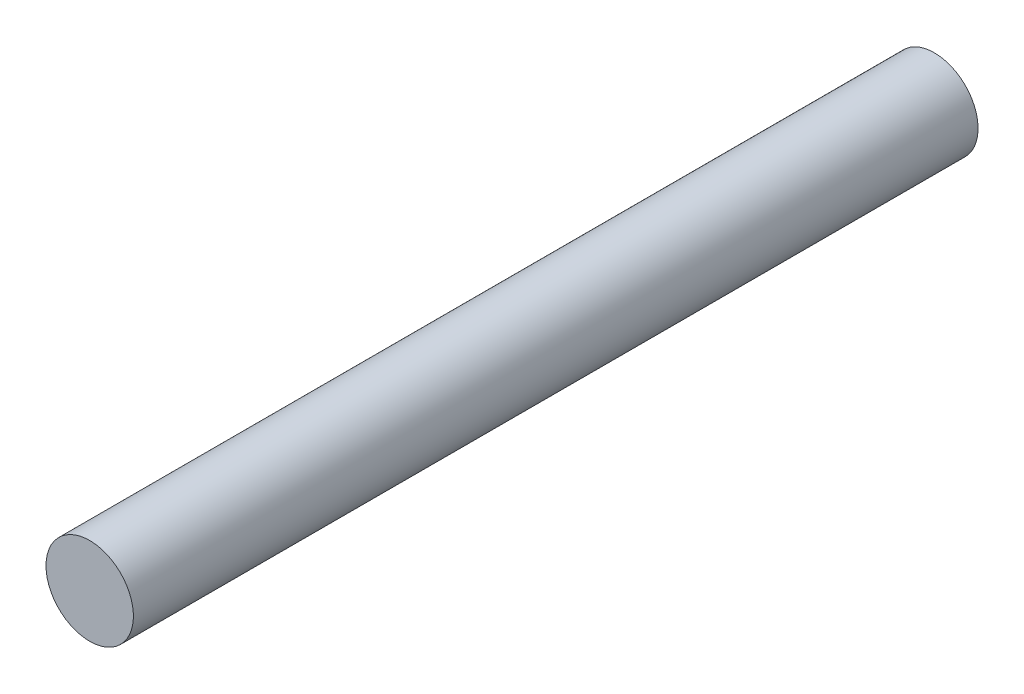
ISO-10303-21;
HEADER;
FILE_DESCRIPTION(('STEP AP214'),'2;1');
FILE_NAME('part.step','',(''),(''),'','','');
FILE_SCHEMA(('AUTOMOTIVE_DESIGN { 1 0 10303 214 1 1 1 1 }'));
ENDSEC;
DATA;
#1=APPLICATION_CONTEXT('core data for automotive mechanical design processes');
#2=APPLICATION_PROTOCOL_DEFINITION('international standard','automotive_design',2000,#1);
#3=PRODUCT_CONTEXT('',#1,'mechanical');
#4=PRODUCT('Part','Part','',(#3));
#5=PRODUCT_RELATED_PRODUCT_CATEGORY('part','',(#4));
#6=PRODUCT_DEFINITION_FORMATION('','',#4);
#7=PRODUCT_DEFINITION_CONTEXT('part definition',#1,'design');
#8=PRODUCT_DEFINITION('design','',#6,#7);
#9=PRODUCT_DEFINITION_SHAPE('','',#8);
#10=(LENGTH_UNIT() NAMED_UNIT(*) SI_UNIT(.MILLI.,.METRE.));
#11=(NAMED_UNIT(*) PLANE_ANGLE_UNIT() SI_UNIT($,.RADIAN.));
#12=(NAMED_UNIT(*) SI_UNIT($,.STERADIAN.) SOLID_ANGLE_UNIT());
#13=UNCERTAINTY_MEASURE_WITH_UNIT(LENGTH_MEASURE(1.E-05),#10,'distance_accuracy_value','');
#14=(GEOMETRIC_REPRESENTATION_CONTEXT(3) GLOBAL_UNCERTAINTY_ASSIGNED_CONTEXT((#13)) GLOBAL_UNIT_ASSIGNED_CONTEXT((#10,
#11,#12)) REPRESENTATION_CONTEXT('',''));
#15=CARTESIAN_POINT('',(0.,0.,0.));
#16=DIRECTION('',(0.,0.,1.));
#17=DIRECTION('',(1.,0.,0.));
#18=AXIS2_PLACEMENT_3D('',#15,#16,#17);
#19=CARTESIAN_POINT('',(0.,0.,58.));
#20=DIRECTION('',(0.,0.,-1.));
#21=DIRECTION('',(-1.,0.,0.));
#22=AXIS2_PLACEMENT_3D('',#19,#20,#21);
#23=CYLINDRICAL_SURFACE('',#22,3.);
#24=CARTESIAN_POINT('',(0.,0.,58.));
#25=DIRECTION('',(0.,0.,1.));
#26=DIRECTION('',(1.,0.,0.));
#27=AXIS2_PLACEMENT_3D('',#24,#25,#26);
#28=CIRCLE('',#27,3.);
#29=CARTESIAN_POINT('',(-3.,0.,58.));
#30=VERTEX_POINT('',#29);
#31=EDGE_CURVE('E10',#30,#30,#28,.T.);
#32=CARTESIAN_POINT('',(0.,0.,0.));
#33=DIRECTION('',(0.,0.,1.));
#34=DIRECTION('',(1.,0.,0.));
#35=AXIS2_PLACEMENT_3D('',#32,#33,#34);
#36=CIRCLE('',#35,3.);
#37=CARTESIAN_POINT('',(-3.,0.,0.));
#38=VERTEX_POINT('',#37);
#39=EDGE_CURVE('E42',#38,#38,#36,.T.);
#40=CARTESIAN_POINT('',(-3.,0.,58.));
#41=CARTESIAN_POINT('',(-3.,0.,57.3958333333333));
#42=CARTESIAN_POINT('',(-3.,0.,56.7916666666667));
#43=CARTESIAN_POINT('',(-3.,0.,55.5833333333333));
#44=CARTESIAN_POINT('',(-3.,0.,54.9791666666667));
#45=CARTESIAN_POINT('',(-3.,0.,53.7708333333333));
#46=CARTESIAN_POINT('',(-3.,0.,53.1666666666667));
#47=CARTESIAN_POINT('',(-3.,0.,51.9583333333333));
#48=CARTESIAN_POINT('',(-3.,0.,51.3541666666667));
#49=CARTESIAN_POINT('',(-3.,0.,50.1458333333333));
#50=CARTESIAN_POINT('',(-3.,0.,49.5416666666667));
#51=CARTESIAN_POINT('',(-3.,0.,48.3333333333333));
#52=CARTESIAN_POINT('',(-3.,0.,47.7291666666667));
#53=CARTESIAN_POINT('',(-3.,0.,46.5208333333333));
#54=CARTESIAN_POINT('',(-3.,0.,45.9166666666667));
#55=CARTESIAN_POINT('',(-3.,0.,44.7083333333333));
#56=CARTESIAN_POINT('',(-3.,0.,44.1041666666667));
#57=CARTESIAN_POINT('',(-3.,0.,42.8958333333333));
#58=CARTESIAN_POINT('',(-3.,0.,42.2916666666667));
#59=CARTESIAN_POINT('',(-3.,0.,41.0833333333333));
#60=CARTESIAN_POINT('',(-3.,0.,40.4791666666667));
#61=CARTESIAN_POINT('',(-3.,0.,39.2708333333333));
#62=CARTESIAN_POINT('',(-3.,0.,38.6666666666667));
#63=CARTESIAN_POINT('',(-3.,0.,37.4583333333333));
#64=CARTESIAN_POINT('',(-3.,0.,36.8541666666667));
#65=CARTESIAN_POINT('',(-3.,0.,35.6458333333333));
#66=CARTESIAN_POINT('',(-3.,0.,35.0416666666667));
#67=CARTESIAN_POINT('',(-3.,0.,33.8333333333333));
#68=CARTESIAN_POINT('',(-3.,0.,33.2291666666667));
#69=CARTESIAN_POINT('',(-3.,0.,32.0208333333333));
#70=CARTESIAN_POINT('',(-3.,0.,31.4166666666667));
#71=CARTESIAN_POINT('',(-3.,0.,30.2083333333333));
#72=CARTESIAN_POINT('',(-3.,0.,29.6041666666667));
#73=CARTESIAN_POINT('',(-3.,0.,28.3958333333333));
#74=CARTESIAN_POINT('',(-3.,0.,27.7916666666667));
#75=CARTESIAN_POINT('',(-3.,0.,26.5833333333333));
#76=CARTESIAN_POINT('',(-3.,0.,25.9791666666667));
#77=CARTESIAN_POINT('',(-3.,0.,24.7708333333333));
#78=CARTESIAN_POINT('',(-3.,0.,24.1666666666667));
#79=CARTESIAN_POINT('',(-3.,0.,22.9583333333333));
#80=CARTESIAN_POINT('',(-3.,0.,22.3541666666667));
#81=CARTESIAN_POINT('',(-3.,0.,21.1458333333333));
#82=CARTESIAN_POINT('',(-3.,0.,20.5416666666667));
#83=CARTESIAN_POINT('',(-3.,0.,19.3333333333333));
#84=CARTESIAN_POINT('',(-3.,0.,18.7291666666667));
#85=CARTESIAN_POINT('',(-3.,0.,17.5208333333333));
#86=CARTESIAN_POINT('',(-3.,0.,16.9166666666667));
#87=CARTESIAN_POINT('',(-3.,0.,15.7083333333333));
#88=CARTESIAN_POINT('',(-3.,0.,15.1041666666667));
#89=CARTESIAN_POINT('',(-3.,0.,13.8958333333333));
#90=CARTESIAN_POINT('',(-3.,0.,13.2916666666667));
#91=CARTESIAN_POINT('',(-3.,0.,12.0833333333333));
#92=CARTESIAN_POINT('',(-3.,0.,11.4791666666667));
#93=CARTESIAN_POINT('',(-3.,0.,10.2708333333333));
#94=CARTESIAN_POINT('',(-3.,0.,9.66666666666667));
#95=CARTESIAN_POINT('',(-3.,0.,8.45833333333333));
#96=CARTESIAN_POINT('',(-3.,0.,7.85416666666667));
#97=CARTESIAN_POINT('',(-3.,0.,6.64583333333333));
#98=CARTESIAN_POINT('',(-3.,0.,6.04166666666667));
#99=CARTESIAN_POINT('',(-3.,0.,4.83333333333333));
#100=CARTESIAN_POINT('',(-3.,0.,4.22916666666667));
#101=CARTESIAN_POINT('',(-3.,0.,3.02083333333334));
#102=CARTESIAN_POINT('',(-3.,0.,2.41666666666667));
#103=CARTESIAN_POINT('',(-3.,0.,1.20833333333333));
#104=CARTESIAN_POINT('',(-3.,0.,0.604166666666666));
#105=CARTESIAN_POINT('',(-3.,0.,0.));
#106=B_SPLINE_CURVE_WITH_KNOTS('',3,(#40,#41,#42,#43,#44,#45,#46,#47,#48,#49,#50,#51,#52,#53,
#54,#55,#56,#57,#58,#59,#60,#61,#62,#63,#64,#65,#66,#67,#68,#69,#70,#71,#72,#73,#74,#75,#76,#77,
#78,#79,#80,#81,#82,#83,#84,#85,#86,#87,#88,#89,#90,#91,#92,#93,#94,#95,#96,#97,#98,#99,#100,
#101,#102,#103,#104,#105),.UNSPECIFIED.,.F.,.F.,(4,2,2,2,2,2,2,2,2,2,2,2,2,2,2,2,2,2,2,2,2,2,2,
2,2,2,2,2,2,2,2,2,4),(0.,1.8125,3.625,5.4375,7.25000000000001,9.0625,10.875,12.6875,14.5,
16.3125,18.125,19.9375,21.75,23.5625,25.375,27.1875,29.,30.8125,32.625,34.4375,36.25,38.0625,
39.875,41.6875,43.5,45.3125,47.125,48.9375,50.75,52.5625,54.375,56.1875,58.),.UNSPECIFIED.);
#107=EDGE_CURVE('BSEAM39',#30,#38,#106,.T.);
#108=ORIENTED_EDGE('',*,*,#31,.F.);
#109=ORIENTED_EDGE('',*,*,#39,.T.);
#110=ORIENTED_EDGE('',*,*,#107,.T.);
#111=ORIENTED_EDGE('',*,*,#107,.F.);
#112=EDGE_LOOP('',(#108,#110,#109,#111));
#113=FACE_BOUND('',#112,.T.);
#114=ADVANCED_FACE('F39',(#113),#23,.T.);
#115=CARTESIAN_POINT('',(0.,0.,58.));
#116=DIRECTION('',(0.,0.,1.));
#117=DIRECTION('',(1.,0.,0.));
#118=AXIS2_PLACEMENT_3D('',#115,#116,#117);
#119=PLANE('',#118);
#120=ORIENTED_EDGE('',*,*,#31,.T.);
#121=EDGE_LOOP('',(#120));
#122=FACE_BOUND('',#121,.T.);
#123=ADVANCED_FACE('F54',(#122),#119,.T.);
#124=CARTESIAN_POINT('',(0.,0.,0.));
#125=DIRECTION('',(0.,0.,1.));
#126=DIRECTION('',(1.,0.,0.));
#127=AXIS2_PLACEMENT_3D('',#124,#125,#126);
#128=PLANE('',#127);
#129=ORIENTED_EDGE('',*,*,#39,.F.);
#130=EDGE_LOOP('',(#129));
#131=FACE_BOUND('',#130,.T.);
#132=ADVANCED_FACE('F52',(#131),#128,.F.);
#133=CLOSED_SHELL('',(#114,#123,#132));
#134=MANIFOLD_SOLID_BREP('B2',#133);
#135=ADVANCED_BREP_SHAPE_REPRESENTATION('',(#18,#134),#14);
#136=SHAPE_DEFINITION_REPRESENTATION(#9,#135);
ENDSEC;
END-ISO-10303-21;
